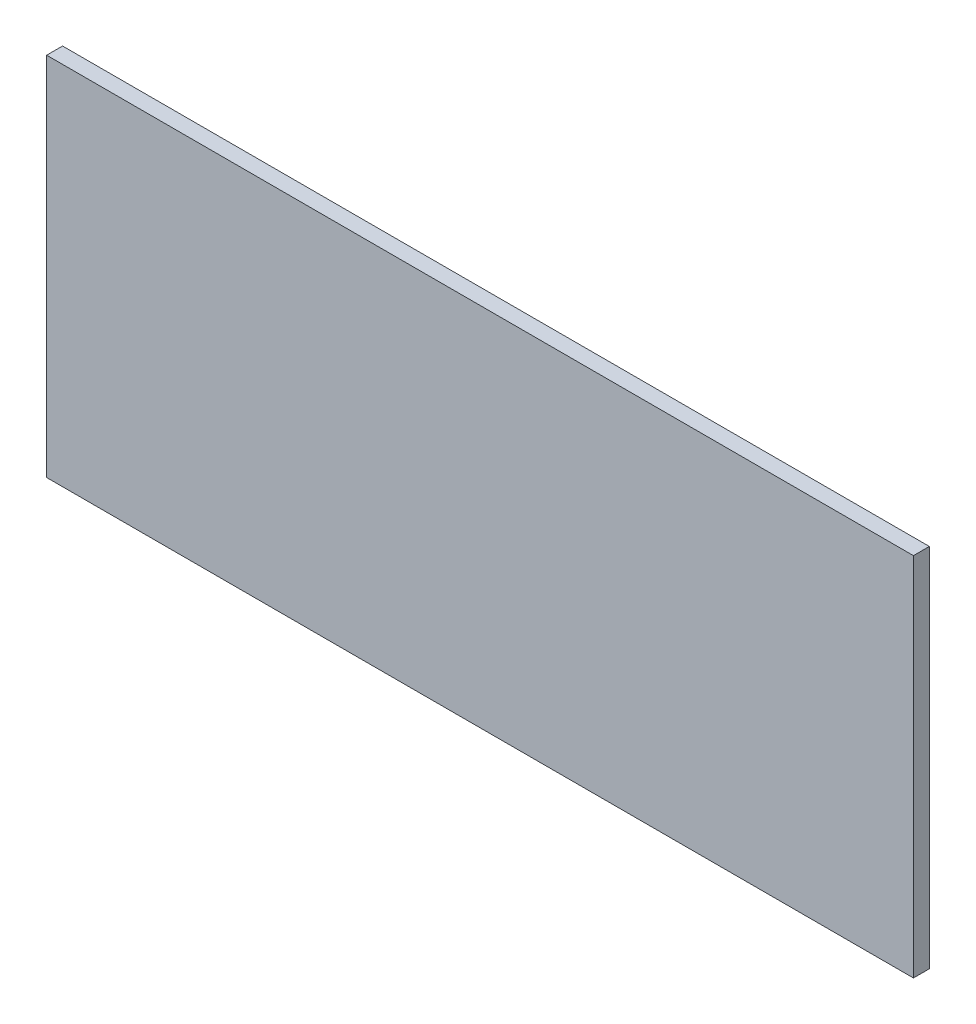
ISO-10303-21;
HEADER;
FILE_DESCRIPTION(('STEP AP214'),'2;1');
FILE_NAME('part.step','',(''),(''),'','','');
FILE_SCHEMA(('AUTOMOTIVE_DESIGN { 1 0 10303 214 1 1 1 1 }'));
ENDSEC;
DATA;
#1=APPLICATION_CONTEXT('core data for automotive mechanical design processes');
#2=APPLICATION_PROTOCOL_DEFINITION('international standard','automotive_design',2000,#1);
#3=PRODUCT_CONTEXT('',#1,'mechanical');
#4=PRODUCT('Part','Part','',(#3));
#5=PRODUCT_RELATED_PRODUCT_CATEGORY('part','',(#4));
#6=PRODUCT_DEFINITION_FORMATION('','',#4);
#7=PRODUCT_DEFINITION_CONTEXT('part definition',#1,'design');
#8=PRODUCT_DEFINITION('design','',#6,#7);
#9=PRODUCT_DEFINITION_SHAPE('','',#8);
#10=(LENGTH_UNIT() NAMED_UNIT(*) SI_UNIT(.MILLI.,.METRE.));
#11=(NAMED_UNIT(*) PLANE_ANGLE_UNIT() SI_UNIT($,.RADIAN.));
#12=(NAMED_UNIT(*) SI_UNIT($,.STERADIAN.) SOLID_ANGLE_UNIT());
#13=UNCERTAINTY_MEASURE_WITH_UNIT(LENGTH_MEASURE(1.E-05),#10,'distance_accuracy_value','');
#14=(GEOMETRIC_REPRESENTATION_CONTEXT(3) GLOBAL_UNCERTAINTY_ASSIGNED_CONTEXT((#13)) GLOBAL_UNIT_ASSIGNED_CONTEXT((#10,
#11,#12)) REPRESENTATION_CONTEXT('',''));
#15=CARTESIAN_POINT('',(0.,0.,0.));
#16=DIRECTION('',(0.,0.,1.));
#17=DIRECTION('',(1.,0.,0.));
#18=AXIS2_PLACEMENT_3D('',#15,#16,#17);
#19=CARTESIAN_POINT('',(272.5,115.,10.));
#20=DIRECTION('',(-1.,0.,0.));
#21=DIRECTION('',(0.,-1.,0.));
#22=AXIS2_PLACEMENT_3D('',#19,#20,#21);
#23=PLANE('',#22);
#24=DIRECTION('',(0.,1.,0.));
#25=VECTOR('',#24,1.);
#26=CARTESIAN_POINT('',(272.5,115.,0.));
#27=LINE('',#26,#25);
#28=CARTESIAN_POINT('',(272.5,-115.,0.));
#29=VERTEX_POINT('',#28);
#30=CARTESIAN_POINT('',(272.5,115.,0.));
#31=VERTEX_POINT('',#30);
#32=EDGE_CURVE('E98',#29,#31,#27,.T.);
#33=ORIENTED_EDGE('',*,*,#32,.T.);
#34=DIRECTION('',(0.,0.,-1.));
#35=VECTOR('',#34,1.);
#36=CARTESIAN_POINT('',(272.5,115.,10.));
#37=LINE('',#36,#35);
#38=CARTESIAN_POINT('',(272.5,115.,10.));
#39=VERTEX_POINT('',#38);
#40=EDGE_CURVE('E11',#39,#31,#37,.T.);
#41=ORIENTED_EDGE('',*,*,#40,.F.);
#42=DIRECTION('',(0.,1.,0.));
#43=VECTOR('',#42,1.);
#44=CARTESIAN_POINT('',(272.5,115.,10.));
#45=LINE('',#44,#43);
#46=CARTESIAN_POINT('',(272.5,-115.,10.));
#47=VERTEX_POINT('',#46);
#48=EDGE_CURVE('E86',#47,#39,#45,.T.);
#49=ORIENTED_EDGE('',*,*,#48,.F.);
#50=DIRECTION('',(0.,0.,-1.));
#51=VECTOR('',#50,1.);
#52=CARTESIAN_POINT('',(272.5,-115.,10.));
#53=LINE('',#52,#51);
#54=EDGE_CURVE('E94',#47,#29,#53,.T.);
#55=ORIENTED_EDGE('',*,*,#54,.T.);
#56=EDGE_LOOP('',(#33,#41,#49,#55));
#57=FACE_BOUND('',#56,.T.);
#58=ADVANCED_FACE('F35',(#57),#23,.F.);
#59=CARTESIAN_POINT('',(-272.5,115.,10.));
#60=DIRECTION('',(0.,-1.,0.));
#61=DIRECTION('',(0.,0.,-1.));
#62=AXIS2_PLACEMENT_3D('',#59,#60,#61);
#63=PLANE('',#62);
#64=DIRECTION('',(-1.,0.,0.));
#65=VECTOR('',#64,1.);
#66=CARTESIAN_POINT('',(-272.5,115.,0.));
#67=LINE('',#66,#65);
#68=CARTESIAN_POINT('',(-272.5,115.,0.));
#69=VERTEX_POINT('',#68);
#70=EDGE_CURVE('E90',#31,#69,#67,.T.);
#71=ORIENTED_EDGE('',*,*,#70,.T.);
#72=DIRECTION('',(0.,0.,-1.));
#73=VECTOR('',#72,1.);
#74=CARTESIAN_POINT('',(-272.5,115.,10.));
#75=LINE('',#74,#73);
#76=CARTESIAN_POINT('',(-272.5,115.,10.));
#77=VERTEX_POINT('',#76);
#78=EDGE_CURVE('E43',#77,#69,#75,.T.);
#79=ORIENTED_EDGE('',*,*,#78,.F.);
#80=DIRECTION('',(-1.,0.,0.));
#81=VECTOR('',#80,1.);
#82=CARTESIAN_POINT('',(-272.5,115.,10.));
#83=LINE('',#82,#81);
#84=EDGE_CURVE('E81',#39,#77,#83,.T.);
#85=ORIENTED_EDGE('',*,*,#84,.F.);
#86=ORIENTED_EDGE('',*,*,#40,.T.);
#87=EDGE_LOOP('',(#71,#79,#85,#86));
#88=FACE_BOUND('',#87,.T.);
#89=ADVANCED_FACE('F89',(#88),#63,.F.);
#90=CARTESIAN_POINT('',(-272.5,115.,10.));
#91=DIRECTION('',(1.,0.,0.));
#92=DIRECTION('',(0.,1.,0.));
#93=AXIS2_PLACEMENT_3D('',#90,#91,#92);
#94=PLANE('',#93);
#95=DIRECTION('',(0.,-1.,0.));
#96=VECTOR('',#95,1.);
#97=CARTESIAN_POINT('',(-272.5,115.,0.));
#98=LINE('',#97,#96);
#99=CARTESIAN_POINT('',(-272.5,-115.,0.));
#100=VERTEX_POINT('',#99);
#101=EDGE_CURVE('E68',#69,#100,#98,.T.);
#102=ORIENTED_EDGE('',*,*,#101,.T.);
#103=DIRECTION('',(0.,0.,-1.));
#104=VECTOR('',#103,1.);
#105=CARTESIAN_POINT('',(-272.5,-115.,10.));
#106=LINE('',#105,#104);
#107=CARTESIAN_POINT('',(-272.5,-115.,10.));
#108=VERTEX_POINT('',#107);
#109=EDGE_CURVE('E91',#108,#100,#106,.T.);
#110=ORIENTED_EDGE('',*,*,#109,.F.);
#111=DIRECTION('',(0.,-1.,0.));
#112=VECTOR('',#111,1.);
#113=CARTESIAN_POINT('',(-272.5,115.,10.));
#114=LINE('',#113,#112);
#115=EDGE_CURVE('E84',#77,#108,#114,.T.);
#116=ORIENTED_EDGE('',*,*,#115,.F.);
#117=ORIENTED_EDGE('',*,*,#78,.T.);
#118=EDGE_LOOP('',(#102,#110,#116,#117));
#119=FACE_BOUND('',#118,.T.);
#120=ADVANCED_FACE('F92',(#119),#94,.F.);
#121=CARTESIAN_POINT('',(-272.5,-115.,10.));
#122=DIRECTION('',(0.,1.,0.));
#123=DIRECTION('',(0.,0.,1.));
#124=AXIS2_PLACEMENT_3D('',#121,#122,#123);
#125=PLANE('',#124);
#126=DIRECTION('',(1.,0.,0.));
#127=VECTOR('',#126,1.);
#128=CARTESIAN_POINT('',(-272.5,-115.,0.));
#129=LINE('',#128,#127);
#130=EDGE_CURVE('E74',#100,#29,#129,.T.);
#131=ORIENTED_EDGE('',*,*,#130,.T.);
#132=ORIENTED_EDGE('',*,*,#54,.F.);
#133=DIRECTION('',(1.,0.,0.));
#134=VECTOR('',#133,1.);
#135=CARTESIAN_POINT('',(-272.5,-115.,10.));
#136=LINE('',#135,#134);
#137=EDGE_CURVE('E51',#108,#47,#136,.T.);
#138=ORIENTED_EDGE('',*,*,#137,.F.);
#139=ORIENTED_EDGE('',*,*,#109,.T.);
#140=EDGE_LOOP('',(#131,#132,#138,#139));
#141=FACE_BOUND('',#140,.T.);
#142=ADVANCED_FACE('F105',(#141),#125,.F.);
#143=CARTESIAN_POINT('',(0.,0.,10.));
#144=DIRECTION('',(0.,0.,1.));
#145=DIRECTION('',(1.,0.,0.));
#146=AXIS2_PLACEMENT_3D('',#143,#144,#145);
#147=PLANE('',#146);
#148=ORIENTED_EDGE('',*,*,#48,.T.);
#149=ORIENTED_EDGE('',*,*,#84,.T.);
#150=ORIENTED_EDGE('',*,*,#115,.T.);
#151=ORIENTED_EDGE('',*,*,#137,.T.);
#152=EDGE_LOOP('',(#148,#149,#150,#151));
#153=FACE_BOUND('',#152,.T.);
#154=ADVANCED_FACE('F82',(#153),#147,.T.);
#155=CARTESIAN_POINT('',(0.,0.,0.));
#156=DIRECTION('',(0.,0.,1.));
#157=DIRECTION('',(1.,0.,0.));
#158=AXIS2_PLACEMENT_3D('',#155,#156,#157);
#159=PLANE('',#158);
#160=ORIENTED_EDGE('',*,*,#32,.F.);
#161=ORIENTED_EDGE('',*,*,#130,.F.);
#162=ORIENTED_EDGE('',*,*,#101,.F.);
#163=ORIENTED_EDGE('',*,*,#70,.F.);
#164=EDGE_LOOP('',(#160,#161,#162,#163));
#165=FACE_BOUND('',#164,.T.);
#166=ADVANCED_FACE('F108',(#165),#159,.F.);
#167=CLOSED_SHELL('',(#58,#89,#120,#142,#154,#166));
#168=MANIFOLD_SOLID_BREP('B2',#167);
#169=ADVANCED_BREP_SHAPE_REPRESENTATION('',(#18,#168),#14);
#170=SHAPE_DEFINITION_REPRESENTATION(#9,#169);
ENDSEC;
END-ISO-10303-21;
